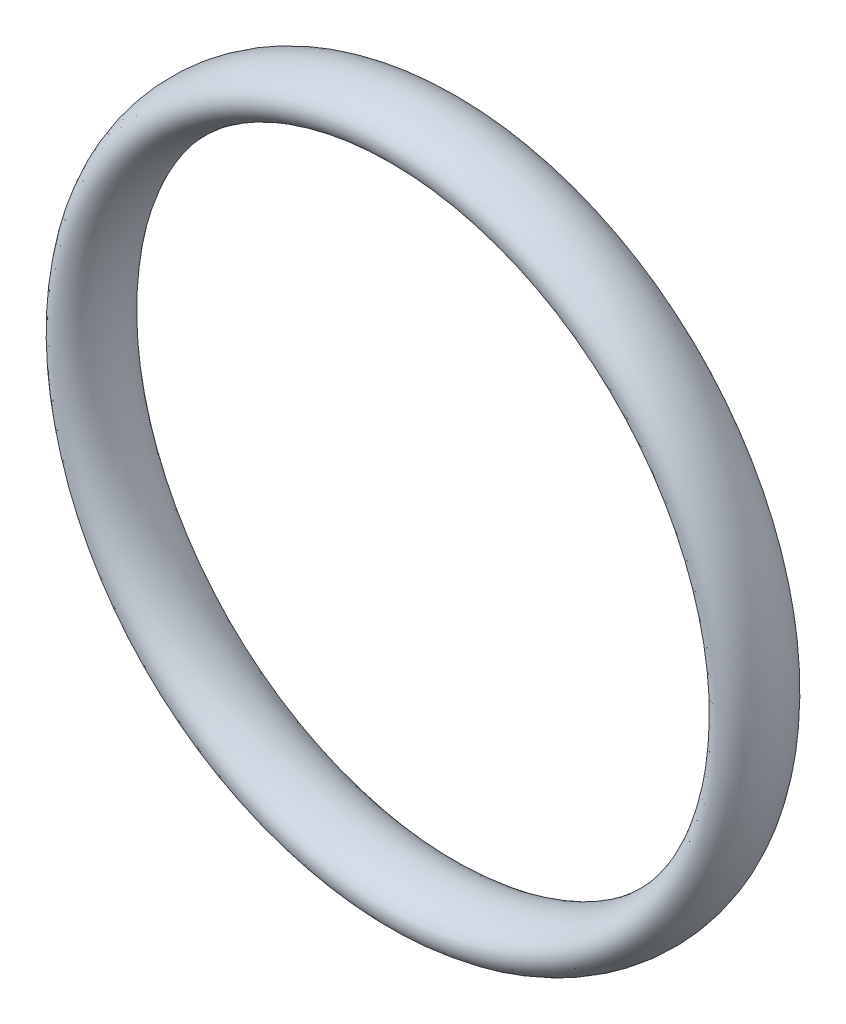
ISO-10303-21;
HEADER;
FILE_DESCRIPTION(('STEP AP214'),'2;1');
FILE_NAME('part.step','',(''),(''),'','','');
FILE_SCHEMA(('AUTOMOTIVE_DESIGN { 1 0 10303 214 1 1 1 1 }'));
ENDSEC;
DATA;
#1=APPLICATION_CONTEXT('core data for automotive mechanical design processes');
#2=APPLICATION_PROTOCOL_DEFINITION('international standard','automotive_design',2000,#1);
#3=PRODUCT_CONTEXT('',#1,'mechanical');
#4=PRODUCT('Part','Part','',(#3));
#5=PRODUCT_RELATED_PRODUCT_CATEGORY('part','',(#4));
#6=PRODUCT_DEFINITION_FORMATION('','',#4);
#7=PRODUCT_DEFINITION_CONTEXT('part definition',#1,'design');
#8=PRODUCT_DEFINITION('design','',#6,#7);
#9=PRODUCT_DEFINITION_SHAPE('','',#8);
#10=(LENGTH_UNIT() NAMED_UNIT(*) SI_UNIT(.MILLI.,.METRE.));
#11=(NAMED_UNIT(*) PLANE_ANGLE_UNIT() SI_UNIT($,.RADIAN.));
#12=(NAMED_UNIT(*) SI_UNIT($,.STERADIAN.) SOLID_ANGLE_UNIT());
#13=UNCERTAINTY_MEASURE_WITH_UNIT(LENGTH_MEASURE(1.E-05),#10,'distance_accuracy_value','');
#14=(GEOMETRIC_REPRESENTATION_CONTEXT(3) GLOBAL_UNCERTAINTY_ASSIGNED_CONTEXT((#13)) GLOBAL_UNIT_ASSIGNED_CONTEXT((#10,
#11,#12)) REPRESENTATION_CONTEXT('',''));
#15=CARTESIAN_POINT('',(0.,0.,0.));
#16=DIRECTION('',(0.,0.,1.));
#17=DIRECTION('',(1.,0.,0.));
#18=AXIS2_PLACEMENT_3D('',#15,#16,#17);
#19=CARTESIAN_POINT('',(0.,17.25,0.));
#20=DIRECTION('',(1.,0.,0.));
#21=DIRECTION('',(0.,0.,1.));
#22=AXIS2_PLACEMENT_3D('',#19,#20,#21);
#23=ELLIPSE('',#22,2.,1.25);
#24=CARTESIAN_POINT('',(0.,0.,0.));
#25=DIRECTION('',(0.,0.,-1.));
#26=AXIS1_PLACEMENT('',#24,#25);
#27=SURFACE_OF_REVOLUTION('',#23,#26);
#28=ADVANCED_FACE('F38',(),#27,.F.);
#29=CLOSED_SHELL('',(#28));
#30=MANIFOLD_SOLID_BREP('B2',#29);
#31=ADVANCED_BREP_SHAPE_REPRESENTATION('',(#18,#30),#14);
#32=SHAPE_DEFINITION_REPRESENTATION(#9,#31);
ENDSEC;
END-ISO-10303-21;
